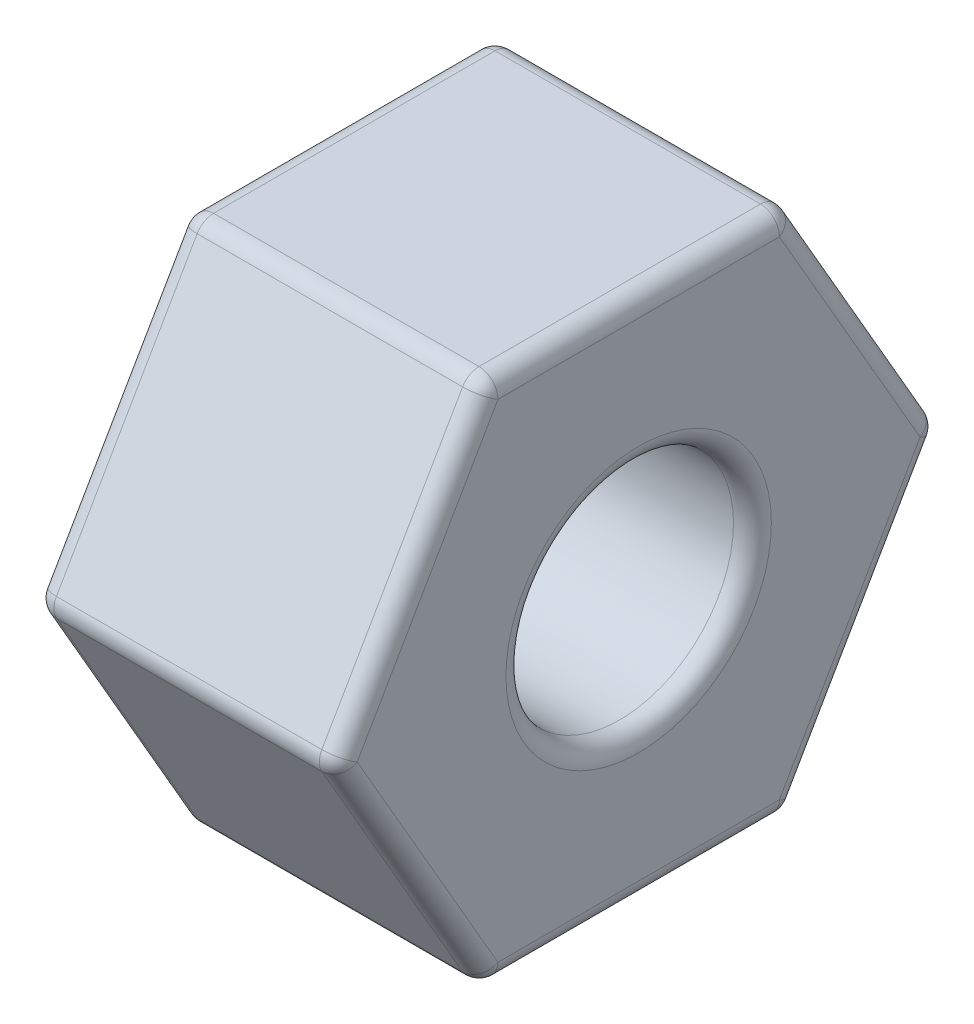
ISO-10303-21;
HEADER;
FILE_DESCRIPTION(('STEP AP214'),'2;1');
FILE_NAME('part.step','',(''),(''),'','','');
FILE_SCHEMA(('AUTOMOTIVE_DESIGN { 1 0 10303 214 1 1 1 1 }'));
ENDSEC;
DATA;
#1=APPLICATION_CONTEXT('core data for automotive mechanical design processes');
#2=APPLICATION_PROTOCOL_DEFINITION('international standard','automotive_design',2000,#1);
#3=PRODUCT_CONTEXT('',#1,'mechanical');
#4=PRODUCT('Part','Part','',(#3));
#5=PRODUCT_RELATED_PRODUCT_CATEGORY('part','',(#4));
#6=PRODUCT_DEFINITION_FORMATION('','',#4);
#7=PRODUCT_DEFINITION_CONTEXT('part definition',#1,'design');
#8=PRODUCT_DEFINITION('design','',#6,#7);
#9=PRODUCT_DEFINITION_SHAPE('','',#8);
#10=(LENGTH_UNIT() NAMED_UNIT(*) SI_UNIT(.MILLI.,.METRE.));
#11=(NAMED_UNIT(*) PLANE_ANGLE_UNIT() SI_UNIT($,.RADIAN.));
#12=(NAMED_UNIT(*) SI_UNIT($,.STERADIAN.) SOLID_ANGLE_UNIT());
#13=UNCERTAINTY_MEASURE_WITH_UNIT(LENGTH_MEASURE(1.E-05),#10,'distance_accuracy_value','');
#14=(GEOMETRIC_REPRESENTATION_CONTEXT(3) GLOBAL_UNCERTAINTY_ASSIGNED_CONTEXT((#13)) GLOBAL_UNIT_ASSIGNED_CONTEXT((#10,
#11,#12)) REPRESENTATION_CONTEXT('',''));
#15=CARTESIAN_POINT('',(0.,0.,0.));
#16=DIRECTION('',(0.,0.,1.));
#17=DIRECTION('',(1.,0.,0.));
#18=AXIS2_PLACEMENT_3D('',#15,#16,#17);
#19=CARTESIAN_POINT('',(8.,0.,0.));
#20=DIRECTION('',(1.,0.,0.));
#21=DIRECTION('',(0.,0.,-1.));
#22=AXIS2_PLACEMENT_3D('',#19,#20,#21);
#23=PLANE('',#22);
#24=CARTESIAN_POINT('',(8.,0.,0.));
#25=DIRECTION('',(1.,0.,0.));
#26=DIRECTION('',(0.,0.,-1.));
#27=AXIS2_PLACEMENT_3D('',#24,#25,#26);
#28=CIRCLE('',#27,3.5);
#29=CARTESIAN_POINT('',(8.,0.,-3.5));
#30=VERTEX_POINT('',#29);
#31=EDGE_CURVE('E227',#30,#30,#28,.F.);
#32=ORIENTED_EDGE('',*,*,#31,.T.);
#33=EDGE_LOOP('',(#32));
#34=FACE_BOUND('',#33,.T.);
#35=DIRECTION('',(0.,-0.866025403784439,-0.5));
#36=VECTOR('',#35,1.);
#37=CARTESIAN_POINT('',(8.,-6.67820323027551,3.56698729810778));
#38=LINE('',#37,#36);
#39=CARTESIAN_POINT('',(8.,0.,7.42264973081037));
#40=VERTEX_POINT('',#39);
#41=CARTESIAN_POINT('',(8.,-6.42820323027551,3.71132486540519));
#42=VERTEX_POINT('',#41);
#43=EDGE_CURVE('E213',#40,#42,#38,.T.);
#44=ORIENTED_EDGE('',*,*,#43,.T.);
#45=DIRECTION('',(0.,0.,-1.));
#46=VECTOR('',#45,1.);
#47=CARTESIAN_POINT('',(8.,-6.42820323027551,-4.));
#48=LINE('',#47,#46);
#49=CARTESIAN_POINT('',(8.,-6.42820323027551,-3.71132486540519));
#50=VERTEX_POINT('',#49);
#51=EDGE_CURVE('E224',#42,#50,#48,.T.);
#52=ORIENTED_EDGE('',*,*,#51,.T.);
#53=DIRECTION('',(0.,0.866025403784439,-0.5));
#54=VECTOR('',#53,1.);
#55=CARTESIAN_POINT('',(8.,0.250000000000004,-7.56698729810778));
#56=LINE('',#55,#54);
#57=CARTESIAN_POINT('',(8.,0.,-7.42264973081037));
#58=VERTEX_POINT('',#57);
#59=EDGE_CURVE('E222',#50,#58,#56,.T.);
#60=ORIENTED_EDGE('',*,*,#59,.T.);
#61=DIRECTION('',(0.,0.866025403784439,0.5));
#62=VECTOR('',#61,1.);
#63=CARTESIAN_POINT('',(8.,6.67820323027551,-3.56698729810778));
#64=LINE('',#63,#62);
#65=CARTESIAN_POINT('',(8.,6.42820323027551,-3.71132486540519));
#66=VERTEX_POINT('',#65);
#67=EDGE_CURVE('E218',#58,#66,#64,.T.);
#68=ORIENTED_EDGE('',*,*,#67,.T.);
#69=DIRECTION('',(0.,0.,1.));
#70=VECTOR('',#69,1.);
#71=CARTESIAN_POINT('',(8.,6.42820323027551,4.));
#72=LINE('',#71,#70);
#73=CARTESIAN_POINT('',(8.,6.42820323027551,3.71132486540519));
#74=VERTEX_POINT('',#73);
#75=EDGE_CURVE('E220',#66,#74,#72,.T.);
#76=ORIENTED_EDGE('',*,*,#75,.T.);
#77=DIRECTION('',(0.,-0.866025403784439,0.5));
#78=VECTOR('',#77,1.);
#79=CARTESIAN_POINT('',(8.,-0.249999999999996,7.56698729810778));
#80=LINE('',#79,#78);
#81=EDGE_CURVE('E214',#74,#40,#80,.T.);
#82=ORIENTED_EDGE('',*,*,#81,.T.);
#83=EDGE_LOOP('',(#44,#52,#60,#68,#76,#82));
#84=FACE_BOUND('',#83,.T.);
#85=ADVANCED_FACE('F41',(#34,#84),#23,.T.);
#86=CARTESIAN_POINT('',(0.,0.,0.));
#87=DIRECTION('',(1.,0.,0.));
#88=DIRECTION('',(0.,0.,-1.));
#89=AXIS2_PLACEMENT_3D('',#86,#87,#88);
#90=PLANE('',#89);
#91=CARTESIAN_POINT('',(0.,0.,0.));
#92=DIRECTION('',(1.,0.,0.));
#93=DIRECTION('',(0.,0.,-1.));
#94=AXIS2_PLACEMENT_3D('',#91,#92,#93);
#95=CIRCLE('',#94,3.5);
#96=CARTESIAN_POINT('',(0.,0.,-3.5));
#97=VERTEX_POINT('',#96);
#98=EDGE_CURVE('E200',#97,#97,#95,.T.);
#99=ORIENTED_EDGE('',*,*,#98,.T.);
#100=EDGE_LOOP('',(#99));
#101=FACE_BOUND('',#100,.T.);
#102=DIRECTION('',(0.,0.866025403784439,-0.5));
#103=VECTOR('',#102,1.);
#104=CARTESIAN_POINT('',(0.,-3.21410161513775,-5.56698729810778));
#105=LINE('',#104,#103);
#106=CARTESIAN_POINT('',(0.,0.,-7.42264973081037));
#107=VERTEX_POINT('',#106);
#108=CARTESIAN_POINT('',(0.,-6.42820323027551,-3.71132486540519));
#109=VERTEX_POINT('',#108);
#110=EDGE_CURVE('E197',#107,#109,#105,.F.);
#111=ORIENTED_EDGE('',*,*,#110,.T.);
#112=DIRECTION('',(0.,0.,-1.));
#113=VECTOR('',#112,1.);
#114=CARTESIAN_POINT('',(0.,-6.42820323027551,0.));
#115=LINE('',#114,#113);
#116=CARTESIAN_POINT('',(0.,-6.42820323027551,3.71132486540519));
#117=VERTEX_POINT('',#116);
#118=EDGE_CURVE('E175',#109,#117,#115,.F.);
#119=ORIENTED_EDGE('',*,*,#118,.T.);
#120=DIRECTION('',(0.,-0.866025403784439,-0.5));
#121=VECTOR('',#120,1.);
#122=CARTESIAN_POINT('',(0.,-3.21410161513775,5.56698729810778));
#123=LINE('',#122,#121);
#124=CARTESIAN_POINT('',(0.,0.,7.42264973081037));
#125=VERTEX_POINT('',#124);
#126=EDGE_CURVE('E190',#117,#125,#123,.F.);
#127=ORIENTED_EDGE('',*,*,#126,.T.);
#128=DIRECTION('',(0.,-0.866025403784439,0.5));
#129=VECTOR('',#128,1.);
#130=CARTESIAN_POINT('',(0.,3.21410161513776,5.56698729810778));
#131=LINE('',#130,#129);
#132=CARTESIAN_POINT('',(0.,6.42820323027551,3.71132486540519));
#133=VERTEX_POINT('',#132);
#134=EDGE_CURVE('E192',#125,#133,#131,.F.);
#135=ORIENTED_EDGE('',*,*,#134,.T.);
#136=DIRECTION('',(0.,0.,1.));
#137=VECTOR('',#136,1.);
#138=CARTESIAN_POINT('',(0.,6.42820323027551,0.));
#139=LINE('',#138,#137);
#140=CARTESIAN_POINT('',(0.,6.42820323027551,-3.71132486540519));
#141=VERTEX_POINT('',#140);
#142=EDGE_CURVE('E408',#133,#141,#139,.F.);
#143=ORIENTED_EDGE('',*,*,#142,.T.);
#144=DIRECTION('',(0.,0.866025403784439,0.5));
#145=VECTOR('',#144,1.);
#146=CARTESIAN_POINT('',(0.,3.21410161513775,-5.56698729810778));
#147=LINE('',#146,#145);
#148=EDGE_CURVE('E204',#141,#107,#147,.F.);
#149=ORIENTED_EDGE('',*,*,#148,.T.);
#150=EDGE_LOOP('',(#111,#119,#127,#135,#143,#149));
#151=FACE_BOUND('',#150,.T.);
#152=ADVANCED_FACE('F194',(#101,#151),#90,.F.);
#153=CARTESIAN_POINT('',(8.,-6.92820323027551,4.));
#154=DIRECTION('',(0.,1.,0.));
#155=DIRECTION('',(0.,0.,1.));
#156=AXIS2_PLACEMENT_3D('',#153,#154,#155);
#157=PLANE('',#156);
#158=DIRECTION('',(0.,0.,-1.));
#159=VECTOR('',#158,1.);
#160=CARTESIAN_POINT('',(7.5,-6.92820323027551,4.));
#161=LINE('',#160,#159);
#162=CARTESIAN_POINT('',(7.5,-6.92820323027551,-3.71132486540519));
#163=VERTEX_POINT('',#162);
#164=CARTESIAN_POINT('',(7.5,-6.92820323027551,3.71132486540519));
#165=VERTEX_POINT('',#164);
#166=EDGE_CURVE('E233',#163,#165,#161,.F.);
#167=ORIENTED_EDGE('',*,*,#166,.T.);
#168=DIRECTION('',(-1.,0.,0.));
#169=VECTOR('',#168,1.);
#170=CARTESIAN_POINT('',(8.,-6.92820323027551,3.71132486540519));
#171=LINE('',#170,#169);
#172=CARTESIAN_POINT('',(0.5,-6.92820323027551,3.71132486540519));
#173=VERTEX_POINT('',#172);
#174=EDGE_CURVE('E235',#165,#173,#171,.T.);
#175=ORIENTED_EDGE('',*,*,#174,.T.);
#176=DIRECTION('',(0.,0.,-1.));
#177=VECTOR('',#176,1.);
#178=CARTESIAN_POINT('',(0.5,-6.92820323027551,4.));
#179=LINE('',#178,#177);
#180=CARTESIAN_POINT('',(0.5,-6.92820323027551,-3.71132486540519));
#181=VERTEX_POINT('',#180);
#182=EDGE_CURVE('E173',#173,#181,#179,.T.);
#183=ORIENTED_EDGE('',*,*,#182,.T.);
#184=DIRECTION('',(-1.,0.,0.));
#185=VECTOR('',#184,1.);
#186=CARTESIAN_POINT('',(8.,-6.92820323027551,-3.71132486540519));
#187=LINE('',#186,#185);
#188=EDGE_CURVE('E226',#181,#163,#187,.F.);
#189=ORIENTED_EDGE('',*,*,#188,.T.);
#190=EDGE_LOOP('',(#167,#175,#183,#189));
#191=FACE_BOUND('',#190,.T.);
#192=ADVANCED_FACE('F485',(#191),#157,.F.);
#193=CARTESIAN_POINT('',(8.,-6.92820323027551,-4.));
#194=DIRECTION('',(0.,0.5,0.866025403784439));
#195=DIRECTION('',(0.,-0.866025403784439,0.5));
#196=AXIS2_PLACEMENT_3D('',#193,#194,#195);
#197=PLANE('',#196);
#198=DIRECTION('',(0.,0.866025403784439,-0.5));
#199=VECTOR('',#198,1.);
#200=CARTESIAN_POINT('',(0.5,-6.92820323027551,-4.));
#201=LINE('',#200,#199);
#202=CARTESIAN_POINT('',(0.5,-6.67820323027551,-4.14433756729741));
#203=VERTEX_POINT('',#202);
#204=CARTESIAN_POINT('',(0.5,-0.249999999999996,-7.85566243270259));
#205=VERTEX_POINT('',#204);
#206=EDGE_CURVE('E238',#203,#205,#201,.T.);
#207=ORIENTED_EDGE('',*,*,#206,.T.);
#208=DIRECTION('',(-1.,0.,0.));
#209=VECTOR('',#208,1.);
#210=CARTESIAN_POINT('',(8.,-0.249999999999996,-7.85566243270259));
#211=LINE('',#210,#209);
#212=CARTESIAN_POINT('',(7.5,-0.249999999999996,-7.85566243270259));
#213=VERTEX_POINT('',#212);
#214=EDGE_CURVE('E244',#205,#213,#211,.F.);
#215=ORIENTED_EDGE('',*,*,#214,.T.);
#216=DIRECTION('',(0.,0.866025403784439,-0.5));
#217=VECTOR('',#216,1.);
#218=CARTESIAN_POINT('',(7.5,-6.92820323027551,-4.));
#219=LINE('',#218,#217);
#220=CARTESIAN_POINT('',(7.5,-6.67820323027551,-4.14433756729741));
#221=VERTEX_POINT('',#220);
#222=EDGE_CURVE('E236',#213,#221,#219,.F.);
#223=ORIENTED_EDGE('',*,*,#222,.T.);
#224=DIRECTION('',(-1.,0.,0.));
#225=VECTOR('',#224,1.);
#226=CARTESIAN_POINT('',(8.,-6.67820323027551,-4.14433756729741));
#227=LINE('',#226,#225);
#228=EDGE_CURVE('E237',#221,#203,#227,.T.);
#229=ORIENTED_EDGE('',*,*,#228,.T.);
#230=EDGE_LOOP('',(#207,#215,#223,#229));
#231=FACE_BOUND('',#230,.T.);
#232=ADVANCED_FACE('F453',(#231),#197,.F.);
#233=CARTESIAN_POINT('',(8.,0.,-8.));
#234=DIRECTION('',(0.,-0.5,0.866025403784439));
#235=DIRECTION('',(0.,-0.866025403784439,-0.5));
#236=AXIS2_PLACEMENT_3D('',#233,#234,#235);
#237=PLANE('',#236);
#238=DIRECTION('',(0.,0.866025403784439,0.5));
#239=VECTOR('',#238,1.);
#240=CARTESIAN_POINT('',(0.5,0.,-8.));
#241=LINE('',#240,#239);
#242=CARTESIAN_POINT('',(0.5,0.250000000000004,-7.85566243270259));
#243=VERTEX_POINT('',#242);
#244=CARTESIAN_POINT('',(0.5,6.67820323027551,-4.14433756729741));
#245=VERTEX_POINT('',#244);
#246=EDGE_CURVE('E248',#243,#245,#241,.T.);
#247=ORIENTED_EDGE('',*,*,#246,.T.);
#248=DIRECTION('',(-1.,0.,0.));
#249=VECTOR('',#248,1.);
#250=CARTESIAN_POINT('',(8.,6.67820323027551,-4.14433756729741));
#251=LINE('',#250,#249);
#252=CARTESIAN_POINT('',(7.5,6.67820323027551,-4.14433756729741));
#253=VERTEX_POINT('',#252);
#254=EDGE_CURVE('E252',#245,#253,#251,.F.);
#255=ORIENTED_EDGE('',*,*,#254,.T.);
#256=DIRECTION('',(0.,0.866025403784439,0.5));
#257=VECTOR('',#256,1.);
#258=CARTESIAN_POINT('',(7.5,0.,-8.));
#259=LINE('',#258,#257);
#260=CARTESIAN_POINT('',(7.5,0.250000000000004,-7.85566243270259));
#261=VERTEX_POINT('',#260);
#262=EDGE_CURVE('E250',#253,#261,#259,.F.);
#263=ORIENTED_EDGE('',*,*,#262,.T.);
#264=DIRECTION('',(-1.,0.,0.));
#265=VECTOR('',#264,1.);
#266=CARTESIAN_POINT('',(8.,0.250000000000004,-7.85566243270259));
#267=LINE('',#266,#265);
#268=EDGE_CURVE('E243',#261,#243,#267,.T.);
#269=ORIENTED_EDGE('',*,*,#268,.T.);
#270=EDGE_LOOP('',(#247,#255,#263,#269));
#271=FACE_BOUND('',#270,.T.);
#272=ADVANCED_FACE('F458',(#271),#237,.F.);
#273=CARTESIAN_POINT('',(8.,6.92820323027551,-4.));
#274=DIRECTION('',(0.,-1.,0.));
#275=DIRECTION('',(0.,0.,-1.));
#276=AXIS2_PLACEMENT_3D('',#273,#274,#275);
#277=PLANE('',#276);
#278=DIRECTION('',(0.,0.,1.));
#279=VECTOR('',#278,1.);
#280=CARTESIAN_POINT('',(7.5,6.92820323027551,-4.));
#281=LINE('',#280,#279);
#282=CARTESIAN_POINT('',(7.5,6.92820323027551,3.71132486540519));
#283=VERTEX_POINT('',#282);
#284=CARTESIAN_POINT('',(7.5,6.92820323027551,-3.71132486540519));
#285=VERTEX_POINT('',#284);
#286=EDGE_CURVE('E258',#283,#285,#281,.F.);
#287=ORIENTED_EDGE('',*,*,#286,.T.);
#288=DIRECTION('',(-1.,0.,0.));
#289=VECTOR('',#288,1.);
#290=CARTESIAN_POINT('',(8.,6.92820323027551,-3.71132486540519));
#291=LINE('',#290,#289);
#292=CARTESIAN_POINT('',(0.5,6.92820323027551,-3.71132486540519));
#293=VERTEX_POINT('',#292);
#294=EDGE_CURVE('E261',#285,#293,#291,.T.);
#295=ORIENTED_EDGE('',*,*,#294,.T.);
#296=DIRECTION('',(0.,0.,1.));
#297=VECTOR('',#296,1.);
#298=CARTESIAN_POINT('',(0.5,6.92820323027551,-4.));
#299=LINE('',#298,#297);
#300=CARTESIAN_POINT('',(0.5,6.92820323027551,3.71132486540519));
#301=VERTEX_POINT('',#300);
#302=EDGE_CURVE('E256',#293,#301,#299,.T.);
#303=ORIENTED_EDGE('',*,*,#302,.T.);
#304=DIRECTION('',(-1.,0.,0.));
#305=VECTOR('',#304,1.);
#306=CARTESIAN_POINT('',(8.,6.92820323027551,3.71132486540519));
#307=LINE('',#306,#305);
#308=EDGE_CURVE('E255',#301,#283,#307,.F.);
#309=ORIENTED_EDGE('',*,*,#308,.T.);
#310=EDGE_LOOP('',(#287,#295,#303,#309));
#311=FACE_BOUND('',#310,.T.);
#312=ADVANCED_FACE('F401',(#311),#277,.F.);
#313=CARTESIAN_POINT('',(8.,6.92820323027551,4.));
#314=DIRECTION('',(0.,-0.5,-0.866025403784439));
#315=DIRECTION('',(0.,0.866025403784439,-0.5));
#316=AXIS2_PLACEMENT_3D('',#313,#314,#315);
#317=PLANE('',#316);
#318=DIRECTION('',(0.,-0.866025403784439,0.5));
#319=VECTOR('',#318,1.);
#320=CARTESIAN_POINT('',(0.5,6.92820323027551,4.));
#321=LINE('',#320,#319);
#322=CARTESIAN_POINT('',(0.5,6.67820323027551,4.14433756729741));
#323=VERTEX_POINT('',#322);
#324=CARTESIAN_POINT('',(0.5,0.250000000000003,7.85566243270259));
#325=VERTEX_POINT('',#324);
#326=EDGE_CURVE('E270',#323,#325,#321,.T.);
#327=ORIENTED_EDGE('',*,*,#326,.T.);
#328=DIRECTION('',(-1.,0.,0.));
#329=VECTOR('',#328,1.);
#330=CARTESIAN_POINT('',(8.,0.250000000000003,7.85566243270259));
#331=LINE('',#330,#329);
#332=CARTESIAN_POINT('',(7.5,0.250000000000003,7.85566243270259));
#333=VERTEX_POINT('',#332);
#334=EDGE_CURVE('E269',#325,#333,#331,.F.);
#335=ORIENTED_EDGE('',*,*,#334,.T.);
#336=DIRECTION('',(0.,-0.866025403784439,0.5));
#337=VECTOR('',#336,1.);
#338=CARTESIAN_POINT('',(7.5,6.92820323027551,4.));
#339=LINE('',#338,#337);
#340=CARTESIAN_POINT('',(7.5,6.67820323027551,4.14433756729741));
#341=VERTEX_POINT('',#340);
#342=EDGE_CURVE('E264',#333,#341,#339,.F.);
#343=ORIENTED_EDGE('',*,*,#342,.T.);
#344=DIRECTION('',(-1.,0.,0.));
#345=VECTOR('',#344,1.);
#346=CARTESIAN_POINT('',(8.,6.67820323027551,4.14433756729741));
#347=LINE('',#346,#345);
#348=EDGE_CURVE('E263',#341,#323,#347,.T.);
#349=ORIENTED_EDGE('',*,*,#348,.T.);
#350=EDGE_LOOP('',(#327,#335,#343,#349));
#351=FACE_BOUND('',#350,.T.);
#352=ADVANCED_FACE('F385',(#351),#317,.F.);
#353=CARTESIAN_POINT('',(8.,0.,8.));
#354=DIRECTION('',(0.,0.5,-0.866025403784439));
#355=DIRECTION('',(0.,0.866025403784439,0.5));
#356=AXIS2_PLACEMENT_3D('',#353,#354,#355);
#357=PLANE('',#356);
#358=DIRECTION('',(0.,-0.866025403784439,-0.5));
#359=VECTOR('',#358,1.);
#360=CARTESIAN_POINT('',(0.5,0.,8.));
#361=LINE('',#360,#359);
#362=CARTESIAN_POINT('',(0.5,-0.249999999999997,7.85566243270259));
#363=VERTEX_POINT('',#362);
#364=CARTESIAN_POINT('',(0.5,-6.67820323027551,4.14433756729741));
#365=VERTEX_POINT('',#364);
#366=EDGE_CURVE('E49',#363,#365,#361,.T.);
#367=ORIENTED_EDGE('',*,*,#366,.T.);
#368=DIRECTION('',(-1.,0.,0.));
#369=VECTOR('',#368,1.);
#370=CARTESIAN_POINT('',(8.,-6.67820323027551,4.14433756729741));
#371=LINE('',#370,#369);
#372=CARTESIAN_POINT('',(7.5,-6.67820323027551,4.14433756729741));
#373=VERTEX_POINT('',#372);
#374=EDGE_CURVE('E11',#365,#373,#371,.F.);
#375=ORIENTED_EDGE('',*,*,#374,.T.);
#376=DIRECTION('',(0.,-0.866025403784439,-0.5));
#377=VECTOR('',#376,1.);
#378=CARTESIAN_POINT('',(7.5,0.,8.));
#379=LINE('',#378,#377);
#380=CARTESIAN_POINT('',(7.5,-0.249999999999997,7.85566243270259));
#381=VERTEX_POINT('',#380);
#382=EDGE_CURVE('E273',#373,#381,#379,.F.);
#383=ORIENTED_EDGE('',*,*,#382,.T.);
#384=DIRECTION('',(-1.,0.,0.));
#385=VECTOR('',#384,1.);
#386=CARTESIAN_POINT('',(8.,-0.249999999999997,7.85566243270259));
#387=LINE('',#386,#385);
#388=EDGE_CURVE('E275',#381,#363,#387,.T.);
#389=ORIENTED_EDGE('',*,*,#388,.T.);
#390=EDGE_LOOP('',(#367,#375,#383,#389));
#391=FACE_BOUND('',#390,.T.);
#392=ADVANCED_FACE('F488',(#391),#357,.F.);
#393=CARTESIAN_POINT('',(8.,0.,0.));
#394=DIRECTION('',(-1.,0.,0.));
#395=DIRECTION('',(0.,0.,1.));
#396=AXIS2_PLACEMENT_3D('',#393,#394,#395);
#397=CYLINDRICAL_SURFACE('',#396,3.);
#398=CARTESIAN_POINT('',(0.5,0.,0.));
#399=DIRECTION('',(1.,0.,0.));
#400=DIRECTION('',(0.,0.,-1.));
#401=AXIS2_PLACEMENT_3D('',#398,#399,#400);
#402=CIRCLE('',#401,3.);
#403=CARTESIAN_POINT('',(0.5,0.,-3.));
#404=VERTEX_POINT('',#403);
#405=EDGE_CURVE('E209',#404,#404,#402,.F.);
#406=ORIENTED_EDGE('',*,*,#405,.T.);
#407=EDGE_LOOP('',(#406));
#408=FACE_BOUND('',#407,.T.);
#409=CARTESIAN_POINT('',(7.5,0.,0.));
#410=DIRECTION('',(1.,0.,0.));
#411=DIRECTION('',(0.,0.,-1.));
#412=AXIS2_PLACEMENT_3D('',#409,#410,#411);
#413=CIRCLE('',#412,3.);
#414=CARTESIAN_POINT('',(7.5,0.,-3.));
#415=VERTEX_POINT('',#414);
#416=EDGE_CURVE('E205',#415,#415,#413,.T.);
#417=ORIENTED_EDGE('',*,*,#416,.T.);
#418=EDGE_LOOP('',(#417));
#419=FACE_BOUND('',#418,.T.);
#420=ADVANCED_FACE('F486',(#408,#419),#397,.F.);
#421=CARTESIAN_POINT('',(0.5,0.,0.));
#422=DIRECTION('',(1.,0.,0.));
#423=DIRECTION('',(0.,0.,-1.));
#424=AXIS2_PLACEMENT_3D('',#421,#422,#423);
#425=TOROIDAL_SURFACE('',#424,3.5,0.5);
#426=ORIENTED_EDGE('',*,*,#405,.F.);
#427=EDGE_LOOP('',(#426));
#428=FACE_BOUND('',#427,.T.);
#429=ORIENTED_EDGE('',*,*,#98,.F.);
#430=EDGE_LOOP('',(#429));
#431=FACE_BOUND('',#430,.T.);
#432=ADVANCED_FACE('F505',(#428,#431),#425,.T.);
#433=CARTESIAN_POINT('',(7.5,0.,0.));
#434=DIRECTION('',(1.,0.,0.));
#435=DIRECTION('',(0.,0.,-1.));
#436=AXIS2_PLACEMENT_3D('',#433,#434,#435);
#437=TOROIDAL_SURFACE('',#436,3.5,0.5);
#438=ORIENTED_EDGE('',*,*,#31,.F.);
#439=EDGE_LOOP('',(#438));
#440=FACE_BOUND('',#439,.T.);
#441=ORIENTED_EDGE('',*,*,#416,.F.);
#442=EDGE_LOOP('',(#441));
#443=FACE_BOUND('',#442,.T.);
#444=ADVANCED_FACE('F503',(#440,#443),#437,.T.);
#445=CARTESIAN_POINT('',(7.5,6.42820323027551,0.));
#446=DIRECTION('',(0.,0.,-1.));
#447=DIRECTION('',(-1.,0.,0.));
#448=AXIS2_PLACEMENT_3D('',#445,#446,#447);
#449=CYLINDRICAL_SURFACE('',#448,0.5);
#450=CARTESIAN_POINT('',(7.5,6.42820323027551,3.71132486540519));
#451=DIRECTION('',(0.,0.,1.));
#452=DIRECTION('',(0.,-1.,0.));
#453=AXIS2_PLACEMENT_3D('',#450,#451,#452);
#454=CIRCLE('',#453,0.5);
#455=EDGE_CURVE('E44',#74,#283,#454,.T.);
#456=ORIENTED_EDGE('',*,*,#455,.F.);
#457=ORIENTED_EDGE('',*,*,#75,.F.);
#458=CARTESIAN_POINT('',(7.5,6.42820323027551,-3.71132486540519));
#459=DIRECTION('',(0.,0.,-1.));
#460=DIRECTION('',(-1.,0.,0.));
#461=AXIS2_PLACEMENT_3D('',#458,#459,#460);
#462=CIRCLE('',#461,0.5);
#463=EDGE_CURVE('E358',#285,#66,#462,.T.);
#464=ORIENTED_EDGE('',*,*,#463,.F.);
#465=ORIENTED_EDGE('',*,*,#286,.F.);
#466=EDGE_LOOP('',(#456,#457,#464,#465));
#467=FACE_BOUND('',#466,.T.);
#468=ADVANCED_FACE('F43',(#467),#449,.T.);
#469=CARTESIAN_POINT('',(7.5,6.42820323027551,3.71132486540519));
#470=DIRECTION('',(1.,0.,0.));
#471=DIRECTION('',(0.,0.,-1.));
#472=AXIS2_PLACEMENT_3D('',#469,#470,#471);
#473=SPHERICAL_SURFACE('',#472,0.5);
#474=CARTESIAN_POINT('',(7.5,6.42820323027551,3.71132486540519));
#475=DIRECTION('',(0.,0.866025403784438,-0.500000000000001));
#476=DIRECTION('',(0.,0.500000000000001,0.866025403784438));
#477=AXIS2_PLACEMENT_3D('',#474,#475,#476);
#478=CIRCLE('',#477,0.5);
#479=EDGE_CURVE('E351',#74,#341,#478,.F.);
#480=ORIENTED_EDGE('',*,*,#479,.F.);
#481=ORIENTED_EDGE('',*,*,#455,.T.);
#482=CARTESIAN_POINT('',(7.5,6.42820323027551,3.71132486540519));
#483=DIRECTION('',(1.,0.,0.));
#484=DIRECTION('',(0.,0.,-1.));
#485=AXIS2_PLACEMENT_3D('',#482,#483,#484);
#486=CIRCLE('',#485,0.5);
#487=EDGE_CURVE('E360',#341,#283,#486,.F.);
#488=ORIENTED_EDGE('',*,*,#487,.F.);
#489=EDGE_LOOP('',(#480,#481,#488));
#490=FACE_BOUND('',#489,.T.);
#491=ADVANCED_FACE('F367',(#490),#473,.T.);
#492=CARTESIAN_POINT('',(7.5,6.42820323027551,-3.71132486540519));
#493=DIRECTION('',(1.,0.,0.));
#494=DIRECTION('',(0.,0.,-1.));
#495=AXIS2_PLACEMENT_3D('',#492,#493,#494);
#496=SPHERICAL_SURFACE('',#495,0.5);
#497=CARTESIAN_POINT('',(7.5,6.42820323027551,-3.71132486540519));
#498=DIRECTION('',(1.,0.,0.));
#499=DIRECTION('',(0.,0.,-1.));
#500=AXIS2_PLACEMENT_3D('',#497,#498,#499);
#501=CIRCLE('',#500,0.5);
#502=EDGE_CURVE('E346',#285,#253,#501,.F.);
#503=ORIENTED_EDGE('',*,*,#502,.F.);
#504=ORIENTED_EDGE('',*,*,#463,.T.);
#505=CARTESIAN_POINT('',(7.5,6.42820323027551,-3.71132486540519));
#506=DIRECTION('',(0.,0.866025403784439,0.5));
#507=DIRECTION('',(0.,-0.5,0.866025403784439));
#508=AXIS2_PLACEMENT_3D('',#505,#506,#507);
#509=CIRCLE('',#508,0.5);
#510=EDGE_CURVE('E352',#253,#66,#509,.F.);
#511=ORIENTED_EDGE('',*,*,#510,.F.);
#512=EDGE_LOOP('',(#503,#504,#511));
#513=FACE_BOUND('',#512,.T.);
#514=ADVANCED_FACE('F393',(#513),#496,.T.);
#515=CARTESIAN_POINT('',(8.,6.42820323027551,3.71132486540519));
#516=DIRECTION('',(-1.,0.,0.));
#517=DIRECTION('',(0.,0.,1.));
#518=AXIS2_PLACEMENT_3D('',#515,#516,#517);
#519=CYLINDRICAL_SURFACE('',#518,0.5);
#520=ORIENTED_EDGE('',*,*,#487,.T.);
#521=ORIENTED_EDGE('',*,*,#308,.F.);
#522=CARTESIAN_POINT('',(0.5,6.42820323027551,3.71132486540519));
#523=DIRECTION('',(-1.,0.,0.));
#524=DIRECTION('',(0.,0.,1.));
#525=AXIS2_PLACEMENT_3D('',#522,#523,#524);
#526=CIRCLE('',#525,0.5);
#527=EDGE_CURVE('E342',#323,#301,#526,.T.);
#528=ORIENTED_EDGE('',*,*,#527,.F.);
#529=ORIENTED_EDGE('',*,*,#348,.F.);
#530=EDGE_LOOP('',(#520,#521,#528,#529));
#531=FACE_BOUND('',#530,.T.);
#532=ADVANCED_FACE('F378',(#531),#519,.T.);
#533=CARTESIAN_POINT('',(7.5,3.21410161513776,5.56698729810778));
#534=DIRECTION('',(0.,0.866025403784439,-0.5));
#535=DIRECTION('',(0.,0.5,0.866025403784439));
#536=AXIS2_PLACEMENT_3D('',#533,#534,#535);
#537=CYLINDRICAL_SURFACE('',#536,0.5);
#538=ORIENTED_EDGE('',*,*,#479,.T.);
#539=ORIENTED_EDGE('',*,*,#342,.F.);
#540=CARTESIAN_POINT('',(7.5,0.,7.42264973081037));
#541=DIRECTION('',(0.,-0.86602540378444,0.499999999999997));
#542=DIRECTION('',(0.,-0.499999999999997,-0.86602540378444));
#543=AXIS2_PLACEMENT_3D('',#540,#541,#542);
#544=CIRCLE('',#543,0.5);
#545=EDGE_CURVE('E338',#40,#333,#544,.T.);
#546=ORIENTED_EDGE('',*,*,#545,.F.);
#547=ORIENTED_EDGE('',*,*,#81,.F.);
#548=EDGE_LOOP('',(#538,#539,#546,#547));
#549=FACE_BOUND('',#548,.T.);
#550=ADVANCED_FACE('F389',(#549),#537,.T.);
#551=CARTESIAN_POINT('',(7.5,3.21410161513775,-5.56698729810778));
#552=DIRECTION('',(0.,-0.866025403784439,-0.5));
#553=DIRECTION('',(0.,0.5,-0.866025403784439));
#554=AXIS2_PLACEMENT_3D('',#551,#552,#553);
#555=CYLINDRICAL_SURFACE('',#554,0.5);
#556=ORIENTED_EDGE('',*,*,#510,.T.);
#557=ORIENTED_EDGE('',*,*,#67,.F.);
#558=CARTESIAN_POINT('',(7.5,0.,-7.42264973081037));
#559=DIRECTION('',(0.,-0.866025403784439,-0.5));
#560=DIRECTION('',(0.,0.5,-0.866025403784439));
#561=AXIS2_PLACEMENT_3D('',#558,#559,#560);
#562=CIRCLE('',#561,0.5);
#563=EDGE_CURVE('E340',#261,#58,#562,.T.);
#564=ORIENTED_EDGE('',*,*,#563,.F.);
#565=ORIENTED_EDGE('',*,*,#262,.F.);
#566=EDGE_LOOP('',(#556,#557,#564,#565));
#567=FACE_BOUND('',#566,.T.);
#568=ADVANCED_FACE('F442',(#567),#555,.T.);
#569=CARTESIAN_POINT('',(8.,6.42820323027551,-3.71132486540519));
#570=DIRECTION('',(-1.,0.,0.));
#571=DIRECTION('',(0.,0.,1.));
#572=AXIS2_PLACEMENT_3D('',#569,#570,#571);
#573=CYLINDRICAL_SURFACE('',#572,0.5);
#574=ORIENTED_EDGE('',*,*,#502,.T.);
#575=ORIENTED_EDGE('',*,*,#254,.F.);
#576=CARTESIAN_POINT('',(0.5,6.42820323027551,-3.71132486540519));
#577=DIRECTION('',(-1.,0.,0.));
#578=DIRECTION('',(0.,0.,1.));
#579=AXIS2_PLACEMENT_3D('',#576,#577,#578);
#580=CIRCLE('',#579,0.5);
#581=EDGE_CURVE('E331',#293,#245,#580,.T.);
#582=ORIENTED_EDGE('',*,*,#581,.F.);
#583=ORIENTED_EDGE('',*,*,#294,.F.);
#584=EDGE_LOOP('',(#574,#575,#582,#583));
#585=FACE_BOUND('',#584,.T.);
#586=ADVANCED_FACE('F396',(#585),#573,.T.);
#587=CARTESIAN_POINT('',(0.5,6.42820323027551,-4.));
#588=DIRECTION('',(0.,0.,1.));
#589=DIRECTION('',(1.,0.,0.));
#590=AXIS2_PLACEMENT_3D('',#587,#588,#589);
#591=CYLINDRICAL_SURFACE('',#590,0.5);
#592=CARTESIAN_POINT('',(0.5,6.42820323027551,3.71132486540519));
#593=DIRECTION('',(0.,0.,1.));
#594=DIRECTION('',(1.,0.,0.));
#595=AXIS2_PLACEMENT_3D('',#592,#593,#594);
#596=CIRCLE('',#595,0.5);
#597=EDGE_CURVE('E341',#301,#133,#596,.T.);
#598=ORIENTED_EDGE('',*,*,#597,.F.);
#599=ORIENTED_EDGE('',*,*,#302,.F.);
#600=CARTESIAN_POINT('',(0.5,6.42820323027551,-3.71132486540519));
#601=DIRECTION('',(0.,0.,-1.));
#602=DIRECTION('',(-1.,0.,0.));
#603=AXIS2_PLACEMENT_3D('',#600,#601,#602);
#604=CIRCLE('',#603,0.5);
#605=EDGE_CURVE('E332',#141,#293,#604,.T.);
#606=ORIENTED_EDGE('',*,*,#605,.F.);
#607=ORIENTED_EDGE('',*,*,#142,.F.);
#608=EDGE_LOOP('',(#598,#599,#606,#607));
#609=FACE_BOUND('',#608,.T.);
#610=ADVANCED_FACE('F410',(#609),#591,.T.);
#611=CARTESIAN_POINT('',(0.5,6.42820323027551,3.71132486540519));
#612=DIRECTION('',(-1.,0.,0.));
#613=DIRECTION('',(0.,0.,1.));
#614=AXIS2_PLACEMENT_3D('',#611,#612,#613);
#615=SPHERICAL_SURFACE('',#614,0.5);
#616=ORIENTED_EDGE('',*,*,#527,.T.);
#617=ORIENTED_EDGE('',*,*,#597,.T.);
#618=CARTESIAN_POINT('',(0.5,6.42820323027551,3.71132486540519));
#619=DIRECTION('',(0.,0.866025403784439,-0.5));
#620=DIRECTION('',(0.,0.5,0.866025403784439));
#621=AXIS2_PLACEMENT_3D('',#618,#619,#620);
#622=CIRCLE('',#621,0.5);
#623=EDGE_CURVE('E327',#323,#133,#622,.F.);
#624=ORIENTED_EDGE('',*,*,#623,.F.);
#625=EDGE_LOOP('',(#616,#617,#624));
#626=FACE_BOUND('',#625,.T.);
#627=ADVANCED_FACE('F415',(#626),#615,.T.);
#628=CARTESIAN_POINT('',(7.5,0.,7.42264973081037));
#629=DIRECTION('',(1.,0.,0.));
#630=DIRECTION('',(0.,1.,0.));
#631=AXIS2_PLACEMENT_3D('',#628,#629,#630);
#632=SPHERICAL_SURFACE('',#631,0.5);
#633=CARTESIAN_POINT('',(7.5,0.,7.42264973081037));
#634=DIRECTION('',(0.,0.866025403784439,0.5));
#635=DIRECTION('',(0.,-0.5,0.866025403784439));
#636=AXIS2_PLACEMENT_3D('',#633,#634,#635);
#637=CIRCLE('',#636,0.5);
#638=EDGE_CURVE('E325',#40,#381,#637,.F.);
#639=ORIENTED_EDGE('',*,*,#638,.F.);
#640=ORIENTED_EDGE('',*,*,#545,.T.);
#641=CARTESIAN_POINT('',(7.5,0.,7.42264973081037));
#642=DIRECTION('',(1.,0.,0.));
#643=DIRECTION('',(0.,0.,-1.));
#644=AXIS2_PLACEMENT_3D('',#641,#642,#643);
#645=CIRCLE('',#644,0.5);
#646=EDGE_CURVE('E324',#381,#333,#645,.F.);
#647=ORIENTED_EDGE('',*,*,#646,.F.);
#648=EDGE_LOOP('',(#639,#640,#647));
#649=FACE_BOUND('',#648,.T.);
#650=ADVANCED_FACE('F421',(#649),#632,.T.);
#651=CARTESIAN_POINT('',(7.5,0.,-7.42264973081037));
#652=DIRECTION('',(1.,0.,0.));
#653=DIRECTION('',(0.,1.,0.));
#654=AXIS2_PLACEMENT_3D('',#651,#652,#653);
#655=SPHERICAL_SURFACE('',#654,0.5);
#656=CARTESIAN_POINT('',(7.5,0.,-7.42264973081037));
#657=DIRECTION('',(1.,0.,0.));
#658=DIRECTION('',(0.,0.,-1.));
#659=AXIS2_PLACEMENT_3D('',#656,#657,#658);
#660=CIRCLE('',#659,0.5);
#661=EDGE_CURVE('E316',#261,#213,#660,.F.);
#662=ORIENTED_EDGE('',*,*,#661,.F.);
#663=ORIENTED_EDGE('',*,*,#563,.T.);
#664=CARTESIAN_POINT('',(7.5,0.,-7.42264973081037));
#665=DIRECTION('',(0.,0.86602540378444,-0.499999999999997));
#666=DIRECTION('',(0.,0.499999999999997,0.86602540378444));
#667=AXIS2_PLACEMENT_3D('',#664,#665,#666);
#668=CIRCLE('',#667,0.5);
#669=EDGE_CURVE('E317',#213,#58,#668,.F.);
#670=ORIENTED_EDGE('',*,*,#669,.F.);
#671=EDGE_LOOP('',(#662,#663,#670));
#672=FACE_BOUND('',#671,.T.);
#673=ADVANCED_FACE('F443',(#672),#655,.T.);
#674=CARTESIAN_POINT('',(0.5,6.42820323027551,-3.71132486540519));
#675=DIRECTION('',(-1.,0.,0.));
#676=DIRECTION('',(0.,0.,1.));
#677=AXIS2_PLACEMENT_3D('',#674,#675,#676);
#678=SPHERICAL_SURFACE('',#677,0.5);
#679=ORIENTED_EDGE('',*,*,#605,.T.);
#680=ORIENTED_EDGE('',*,*,#581,.T.);
#681=CARTESIAN_POINT('',(0.5,6.42820323027551,-3.71132486540519));
#682=DIRECTION('',(0.,0.866025403784438,0.500000000000001));
#683=DIRECTION('',(0.,-0.500000000000001,0.866025403784438));
#684=AXIS2_PLACEMENT_3D('',#681,#682,#683);
#685=CIRCLE('',#684,0.5);
#686=EDGE_CURVE('E314',#141,#245,#685,.F.);
#687=ORIENTED_EDGE('',*,*,#686,.F.);
#688=EDGE_LOOP('',(#679,#680,#687));
#689=FACE_BOUND('',#688,.T.);
#690=ADVANCED_FACE('F470',(#689),#678,.T.);
#691=CARTESIAN_POINT('',(0.5,6.67820323027551,3.56698729810778));
#692=DIRECTION('',(0.,-0.866025403784439,0.5));
#693=DIRECTION('',(0.,-0.5,-0.866025403784439));
#694=AXIS2_PLACEMENT_3D('',#691,#692,#693);
#695=CYLINDRICAL_SURFACE('',#694,0.5);
#696=ORIENTED_EDGE('',*,*,#623,.T.);
#697=ORIENTED_EDGE('',*,*,#134,.F.);
#698=CARTESIAN_POINT('',(0.5,0.,7.42264973081037));
#699=DIRECTION('',(0.,-0.866025403784439,0.5));
#700=DIRECTION('',(0.,-0.5,-0.866025403784439));
#701=AXIS2_PLACEMENT_3D('',#698,#699,#700);
#702=CIRCLE('',#701,0.5);
#703=EDGE_CURVE('E313',#325,#125,#702,.T.);
#704=ORIENTED_EDGE('',*,*,#703,.F.);
#705=ORIENTED_EDGE('',*,*,#326,.F.);
#706=EDGE_LOOP('',(#696,#697,#704,#705));
#707=FACE_BOUND('',#706,.T.);
#708=ADVANCED_FACE('F413',(#707),#695,.T.);
#709=CARTESIAN_POINT('',(8.,0.,7.42264973081037));
#710=DIRECTION('',(-1.,0.,0.));
#711=DIRECTION('',(0.,0.,1.));
#712=AXIS2_PLACEMENT_3D('',#709,#710,#711);
#713=CYLINDRICAL_SURFACE('',#712,0.5);
#714=ORIENTED_EDGE('',*,*,#646,.T.);
#715=ORIENTED_EDGE('',*,*,#334,.F.);
#716=CARTESIAN_POINT('',(0.5,0.,7.42264973081037));
#717=DIRECTION('',(-1.,0.,0.));
#718=DIRECTION('',(0.,0.,1.));
#719=AXIS2_PLACEMENT_3D('',#716,#717,#718);
#720=CIRCLE('',#719,0.5);
#721=EDGE_CURVE('E310',#363,#325,#720,.T.);
#722=ORIENTED_EDGE('',*,*,#721,.F.);
#723=ORIENTED_EDGE('',*,*,#388,.F.);
#724=EDGE_LOOP('',(#714,#715,#722,#723));
#725=FACE_BOUND('',#724,.T.);
#726=ADVANCED_FACE('F420',(#725),#713,.T.);
#727=CARTESIAN_POINT('',(7.5,-3.21410161513775,5.56698729810778));
#728=DIRECTION('',(0.,0.866025403784439,0.5));
#729=DIRECTION('',(0.,-0.5,0.866025403784439));
#730=AXIS2_PLACEMENT_3D('',#727,#728,#729);
#731=CYLINDRICAL_SURFACE('',#730,0.5);
#732=ORIENTED_EDGE('',*,*,#638,.T.);
#733=ORIENTED_EDGE('',*,*,#382,.F.);
#734=CARTESIAN_POINT('',(7.5,-6.42820323027551,3.71132486540519));
#735=DIRECTION('',(0.,-0.866025403784439,-0.5));
#736=DIRECTION('',(0.,0.5,-0.866025403784439));
#737=AXIS2_PLACEMENT_3D('',#734,#735,#736);
#738=CIRCLE('',#737,0.5);
#739=EDGE_CURVE('E308',#42,#373,#738,.T.);
#740=ORIENTED_EDGE('',*,*,#739,.F.);
#741=ORIENTED_EDGE('',*,*,#43,.F.);
#742=EDGE_LOOP('',(#732,#733,#740,#741));
#743=FACE_BOUND('',#742,.T.);
#744=ADVANCED_FACE('F426',(#743),#731,.T.);
#745=CARTESIAN_POINT('',(7.5,-6.42820323027551,0.));
#746=DIRECTION('',(0.,0.,1.));
#747=DIRECTION('',(0.,-1.,0.));
#748=AXIS2_PLACEMENT_3D('',#745,#746,#747);
#749=CYLINDRICAL_SURFACE('',#748,0.5);
#750=CARTESIAN_POINT('',(7.5,-6.42820323027551,-3.71132486540519));
#751=DIRECTION('',(0.,0.,-1.));
#752=DIRECTION('',(-1.,0.,0.));
#753=AXIS2_PLACEMENT_3D('',#750,#751,#752);
#754=CIRCLE('',#753,0.5);
#755=EDGE_CURVE('E298',#50,#163,#754,.T.);
#756=ORIENTED_EDGE('',*,*,#755,.F.);
#757=ORIENTED_EDGE('',*,*,#51,.F.);
#758=CARTESIAN_POINT('',(7.5,-6.42820323027551,3.71132486540519));
#759=DIRECTION('',(0.,0.,1.));
#760=DIRECTION('',(1.,0.,0.));
#761=AXIS2_PLACEMENT_3D('',#758,#759,#760);
#762=CIRCLE('',#761,0.5);
#763=EDGE_CURVE('E302',#165,#42,#762,.T.);
#764=ORIENTED_EDGE('',*,*,#763,.F.);
#765=ORIENTED_EDGE('',*,*,#166,.F.);
#766=EDGE_LOOP('',(#756,#757,#764,#765));
#767=FACE_BOUND('',#766,.T.);
#768=ADVANCED_FACE('F434',(#767),#749,.T.);
#769=CARTESIAN_POINT('',(7.5,-3.21410161513775,-5.56698729810778));
#770=DIRECTION('',(0.,-0.866025403784439,0.5));
#771=DIRECTION('',(0.,-0.5,-0.866025403784439));
#772=AXIS2_PLACEMENT_3D('',#769,#770,#771);
#773=CYLINDRICAL_SURFACE('',#772,0.5);
#774=ORIENTED_EDGE('',*,*,#669,.T.);
#775=ORIENTED_EDGE('',*,*,#59,.F.);
#776=CARTESIAN_POINT('',(7.5,-6.42820323027551,-3.71132486540519));
#777=DIRECTION('',(0.,-0.866025403784438,0.500000000000001));
#778=DIRECTION('',(0.,-0.500000000000001,-0.866025403784438));
#779=AXIS2_PLACEMENT_3D('',#776,#777,#778);
#780=CIRCLE('',#779,0.5);
#781=EDGE_CURVE('E299',#221,#50,#780,.T.);
#782=ORIENTED_EDGE('',*,*,#781,.F.);
#783=ORIENTED_EDGE('',*,*,#222,.F.);
#784=EDGE_LOOP('',(#774,#775,#782,#783));
#785=FACE_BOUND('',#784,.T.);
#786=ADVANCED_FACE('F449',(#785),#773,.T.);
#787=CARTESIAN_POINT('',(8.,0.,-7.42264973081037));
#788=DIRECTION('',(-1.,0.,0.));
#789=DIRECTION('',(0.,0.,1.));
#790=AXIS2_PLACEMENT_3D('',#787,#788,#789);
#791=CYLINDRICAL_SURFACE('',#790,0.5);
#792=ORIENTED_EDGE('',*,*,#661,.T.);
#793=ORIENTED_EDGE('',*,*,#214,.F.);
#794=CARTESIAN_POINT('',(0.5,0.,-7.42264973081037));
#795=DIRECTION('',(-1.,0.,0.));
#796=DIRECTION('',(0.,0.,1.));
#797=AXIS2_PLACEMENT_3D('',#794,#795,#796);
#798=CIRCLE('',#797,0.5);
#799=EDGE_CURVE('E293',#243,#205,#798,.T.);
#800=ORIENTED_EDGE('',*,*,#799,.F.);
#801=ORIENTED_EDGE('',*,*,#268,.F.);
#802=EDGE_LOOP('',(#792,#793,#800,#801));
#803=FACE_BOUND('',#802,.T.);
#804=ADVANCED_FACE('F460',(#803),#791,.T.);
#805=CARTESIAN_POINT('',(0.5,-0.249999999999997,-7.56698729810778));
#806=DIRECTION('',(0.,0.866025403784439,0.5));
#807=DIRECTION('',(0.,-0.5,0.866025403784439));
#808=AXIS2_PLACEMENT_3D('',#805,#806,#807);
#809=CYLINDRICAL_SURFACE('',#808,0.5);
#810=ORIENTED_EDGE('',*,*,#686,.T.);
#811=ORIENTED_EDGE('',*,*,#246,.F.);
#812=CARTESIAN_POINT('',(0.5,0.,-7.42264973081037));
#813=DIRECTION('',(0.,-0.866025403784438,-0.5));
#814=DIRECTION('',(0.,0.5,-0.866025403784439));
#815=AXIS2_PLACEMENT_3D('',#812,#813,#814);
#816=CIRCLE('',#815,0.5);
#817=EDGE_CURVE('E295',#107,#243,#816,.T.);
#818=ORIENTED_EDGE('',*,*,#817,.F.);
#819=ORIENTED_EDGE('',*,*,#148,.F.);
#820=EDGE_LOOP('',(#810,#811,#818,#819));
#821=FACE_BOUND('',#820,.T.);
#822=ADVANCED_FACE('F464',(#821),#809,.T.);
#823=CARTESIAN_POINT('',(0.5,0.,7.42264973081037));
#824=DIRECTION('',(-1.,0.,0.));
#825=DIRECTION('',(0.,-1.,0.));
#826=AXIS2_PLACEMENT_3D('',#823,#824,#825);
#827=SPHERICAL_SURFACE('',#826,0.5);
#828=ORIENTED_EDGE('',*,*,#721,.T.);
#829=ORIENTED_EDGE('',*,*,#703,.T.);
#830=CARTESIAN_POINT('',(0.5,0.,7.42264973081037));
#831=DIRECTION('',(0.,0.866025403784438,0.5));
#832=DIRECTION('',(0.,-0.5,0.866025403784439));
#833=AXIS2_PLACEMENT_3D('',#830,#831,#832);
#834=CIRCLE('',#833,0.5);
#835=EDGE_CURVE('E188',#363,#125,#834,.F.);
#836=ORIENTED_EDGE('',*,*,#835,.F.);
#837=EDGE_LOOP('',(#828,#829,#836));
#838=FACE_BOUND('',#837,.T.);
#839=ADVANCED_FACE('F545',(#838),#827,.T.);
#840=CARTESIAN_POINT('',(7.5,-6.42820323027551,3.71132486540519));
#841=DIRECTION('',(1.,0.,0.));
#842=DIRECTION('',(0.,0.,-1.));
#843=AXIS2_PLACEMENT_3D('',#840,#841,#842);
#844=SPHERICAL_SURFACE('',#843,0.5);
#845=ORIENTED_EDGE('',*,*,#763,.T.);
#846=ORIENTED_EDGE('',*,*,#739,.T.);
#847=CARTESIAN_POINT('',(7.5,-6.42820323027551,3.71132486540519));
#848=DIRECTION('',(1.,0.,0.));
#849=DIRECTION('',(0.,0.,-1.));
#850=AXIS2_PLACEMENT_3D('',#847,#848,#849);
#851=CIRCLE('',#850,0.5);
#852=EDGE_CURVE('E287',#165,#373,#851,.F.);
#853=ORIENTED_EDGE('',*,*,#852,.F.);
#854=EDGE_LOOP('',(#845,#846,#853));
#855=FACE_BOUND('',#854,.T.);
#856=ADVANCED_FACE('F429',(#855),#844,.T.);
#857=CARTESIAN_POINT('',(7.5,-6.42820323027551,-3.71132486540519));
#858=DIRECTION('',(1.,0.,0.));
#859=DIRECTION('',(0.,0.,-1.));
#860=AXIS2_PLACEMENT_3D('',#857,#858,#859);
#861=SPHERICAL_SURFACE('',#860,0.5);
#862=ORIENTED_EDGE('',*,*,#781,.T.);
#863=ORIENTED_EDGE('',*,*,#755,.T.);
#864=CARTESIAN_POINT('',(7.5,-6.42820323027551,-3.71132486540519));
#865=DIRECTION('',(1.,0.,0.));
#866=DIRECTION('',(0.,0.,-1.));
#867=AXIS2_PLACEMENT_3D('',#864,#865,#866);
#868=CIRCLE('',#867,0.5);
#869=EDGE_CURVE('E283',#221,#163,#868,.F.);
#870=ORIENTED_EDGE('',*,*,#869,.F.);
#871=EDGE_LOOP('',(#862,#863,#870));
#872=FACE_BOUND('',#871,.T.);
#873=ADVANCED_FACE('F532',(#872),#861,.T.);
#874=CARTESIAN_POINT('',(0.5,0.,-7.42264973081037));
#875=DIRECTION('',(-1.,0.,0.));
#876=DIRECTION('',(0.,-1.,0.));
#877=AXIS2_PLACEMENT_3D('',#874,#875,#876);
#878=SPHERICAL_SURFACE('',#877,0.5);
#879=ORIENTED_EDGE('',*,*,#817,.T.);
#880=ORIENTED_EDGE('',*,*,#799,.T.);
#881=CARTESIAN_POINT('',(0.5,0.,-7.42264973081037));
#882=DIRECTION('',(0.,0.866025403784439,-0.5));
#883=DIRECTION('',(0.,0.5,0.866025403784439));
#884=AXIS2_PLACEMENT_3D('',#881,#882,#883);
#885=CIRCLE('',#884,0.5);
#886=EDGE_CURVE('E184',#107,#205,#885,.F.);
#887=ORIENTED_EDGE('',*,*,#886,.F.);
#888=EDGE_LOOP('',(#879,#880,#887));
#889=FACE_BOUND('',#888,.T.);
#890=ADVANCED_FACE('F535',(#889),#878,.T.);
#891=CARTESIAN_POINT('',(0.5,0.250000000000003,7.56698729810778));
#892=DIRECTION('',(0.,-0.866025403784439,-0.5));
#893=DIRECTION('',(0.,0.5,-0.866025403784439));
#894=AXIS2_PLACEMENT_3D('',#891,#892,#893);
#895=CYLINDRICAL_SURFACE('',#894,0.5);
#896=ORIENTED_EDGE('',*,*,#835,.T.);
#897=ORIENTED_EDGE('',*,*,#126,.F.);
#898=CARTESIAN_POINT('',(0.5,-6.42820323027551,3.71132486540519));
#899=DIRECTION('',(0.,-0.866025403784438,-0.500000000000001));
#900=DIRECTION('',(0.,0.500000000000001,-0.866025403784438));
#901=AXIS2_PLACEMENT_3D('',#898,#899,#900);
#902=CIRCLE('',#901,0.5);
#903=EDGE_CURVE('E180',#365,#117,#902,.T.);
#904=ORIENTED_EDGE('',*,*,#903,.F.);
#905=ORIENTED_EDGE('',*,*,#366,.F.);
#906=EDGE_LOOP('',(#896,#897,#904,#905));
#907=FACE_BOUND('',#906,.T.);
#908=ADVANCED_FACE('F189',(#907),#895,.T.);
#909=CARTESIAN_POINT('',(8.,-6.42820323027551,3.71132486540519));
#910=DIRECTION('',(-1.,0.,0.));
#911=DIRECTION('',(0.,0.,1.));
#912=AXIS2_PLACEMENT_3D('',#909,#910,#911);
#913=CYLINDRICAL_SURFACE('',#912,0.5);
#914=ORIENTED_EDGE('',*,*,#852,.T.);
#915=ORIENTED_EDGE('',*,*,#374,.F.);
#916=CARTESIAN_POINT('',(0.5,-6.42820323027551,3.71132486540519));
#917=DIRECTION('',(-1.,0.,0.));
#918=DIRECTION('',(0.,0.,1.));
#919=AXIS2_PLACEMENT_3D('',#916,#917,#918);
#920=CIRCLE('',#919,0.5);
#921=EDGE_CURVE('E59',#173,#365,#920,.T.);
#922=ORIENTED_EDGE('',*,*,#921,.F.);
#923=ORIENTED_EDGE('',*,*,#174,.F.);
#924=EDGE_LOOP('',(#914,#915,#922,#923));
#925=FACE_BOUND('',#924,.T.);
#926=ADVANCED_FACE('F524',(#925),#913,.T.);
#927=CARTESIAN_POINT('',(8.,-6.42820323027551,-3.71132486540519));
#928=DIRECTION('',(-1.,0.,0.));
#929=DIRECTION('',(0.,0.,1.));
#930=AXIS2_PLACEMENT_3D('',#927,#928,#929);
#931=CYLINDRICAL_SURFACE('',#930,0.5);
#932=ORIENTED_EDGE('',*,*,#869,.T.);
#933=ORIENTED_EDGE('',*,*,#188,.F.);
#934=CARTESIAN_POINT('',(0.5,-6.42820323027551,-3.71132486540519));
#935=DIRECTION('',(-1.,0.,0.));
#936=DIRECTION('',(0.,0.,1.));
#937=AXIS2_PLACEMENT_3D('',#934,#935,#936);
#938=CIRCLE('',#937,0.5);
#939=EDGE_CURVE('E278',#203,#181,#938,.T.);
#940=ORIENTED_EDGE('',*,*,#939,.F.);
#941=ORIENTED_EDGE('',*,*,#228,.F.);
#942=EDGE_LOOP('',(#932,#933,#940,#941));
#943=FACE_BOUND('',#942,.T.);
#944=ADVANCED_FACE('F521',(#943),#931,.T.);
#945=CARTESIAN_POINT('',(0.5,-6.67820323027551,-3.56698729810778));
#946=DIRECTION('',(0.,0.866025403784439,-0.5));
#947=DIRECTION('',(0.,0.5,0.866025403784439));
#948=AXIS2_PLACEMENT_3D('',#945,#946,#947);
#949=CYLINDRICAL_SURFACE('',#948,0.5);
#950=ORIENTED_EDGE('',*,*,#886,.T.);
#951=ORIENTED_EDGE('',*,*,#206,.F.);
#952=CARTESIAN_POINT('',(0.5,-6.42820323027551,-3.71132486540519));
#953=DIRECTION('',(0.,-0.866025403784438,0.5));
#954=DIRECTION('',(0.,-0.5,-0.866025403784438));
#955=AXIS2_PLACEMENT_3D('',#952,#953,#954);
#956=CIRCLE('',#955,0.5);
#957=EDGE_CURVE('E178',#109,#203,#956,.T.);
#958=ORIENTED_EDGE('',*,*,#957,.F.);
#959=ORIENTED_EDGE('',*,*,#110,.F.);
#960=EDGE_LOOP('',(#950,#951,#958,#959));
#961=FACE_BOUND('',#960,.T.);
#962=ADVANCED_FACE('F519',(#961),#949,.T.);
#963=CARTESIAN_POINT('',(0.5,-6.42820323027551,3.71132486540519));
#964=DIRECTION('',(-1.,0.,0.));
#965=DIRECTION('',(0.,0.,1.));
#966=AXIS2_PLACEMENT_3D('',#963,#964,#965);
#967=SPHERICAL_SURFACE('',#966,0.5);
#968=ORIENTED_EDGE('',*,*,#921,.T.);
#969=ORIENTED_EDGE('',*,*,#903,.T.);
#970=CARTESIAN_POINT('',(0.5,-6.42820323027551,3.71132486540519));
#971=DIRECTION('',(0.,0.,1.));
#972=DIRECTION('',(1.,0.,0.));
#973=AXIS2_PLACEMENT_3D('',#970,#971,#972);
#974=CIRCLE('',#973,0.5);
#975=EDGE_CURVE('E166',#173,#117,#974,.F.);
#976=ORIENTED_EDGE('',*,*,#975,.F.);
#977=EDGE_LOOP('',(#968,#969,#976));
#978=FACE_BOUND('',#977,.T.);
#979=ADVANCED_FACE('F182',(#978),#967,.T.);
#980=CARTESIAN_POINT('',(0.5,-6.42820323027551,-3.71132486540519));
#981=DIRECTION('',(-1.,0.,0.));
#982=DIRECTION('',(0.,0.,1.));
#983=AXIS2_PLACEMENT_3D('',#980,#981,#982);
#984=SPHERICAL_SURFACE('',#983,0.5);
#985=ORIENTED_EDGE('',*,*,#957,.T.);
#986=ORIENTED_EDGE('',*,*,#939,.T.);
#987=CARTESIAN_POINT('',(0.5,-6.42820323027551,-3.71132486540519));
#988=DIRECTION('',(0.,0.,-1.));
#989=DIRECTION('',(-1.,0.,0.));
#990=AXIS2_PLACEMENT_3D('',#987,#988,#989);
#991=CIRCLE('',#990,0.5);
#992=EDGE_CURVE('E179',#109,#181,#991,.F.);
#993=ORIENTED_EDGE('',*,*,#992,.F.);
#994=EDGE_LOOP('',(#985,#986,#993));
#995=FACE_BOUND('',#994,.T.);
#996=ADVANCED_FACE('F515',(#995),#984,.T.);
#997=CARTESIAN_POINT('',(0.5,-6.42820323027551,4.));
#998=DIRECTION('',(0.,0.,-1.));
#999=DIRECTION('',(0.,1.,0.));
#1000=AXIS2_PLACEMENT_3D('',#997,#998,#999);
#1001=CYLINDRICAL_SURFACE('',#1000,0.5);
#1002=ORIENTED_EDGE('',*,*,#975,.T.);
#1003=ORIENTED_EDGE('',*,*,#118,.F.);
#1004=ORIENTED_EDGE('',*,*,#992,.T.);
#1005=ORIENTED_EDGE('',*,*,#182,.F.);
#1006=EDGE_LOOP('',(#1002,#1003,#1004,#1005));
#1007=FACE_BOUND('',#1006,.T.);
#1008=ADVANCED_FACE('F168',(#1007),#1001,.T.);
#1009=CLOSED_SHELL('',(#85,#152,#192,#232,#272,#312,#352,#392,#420,#432,#444,#468,#491,#514,
#532,#550,#568,#586,#610,#627,#650,#673,#690,#708,#726,#744,#768,#786,#804,#822,#839,#856,#873,
#890,#908,#926,#944,#962,#979,#996,#1008));
#1010=MANIFOLD_SOLID_BREP('B2',#1009);
#1011=ADVANCED_BREP_SHAPE_REPRESENTATION('',(#18,#1010),#14);
#1012=SHAPE_DEFINITION_REPRESENTATION(#9,#1011);
ENDSEC;
END-ISO-10303-21;
